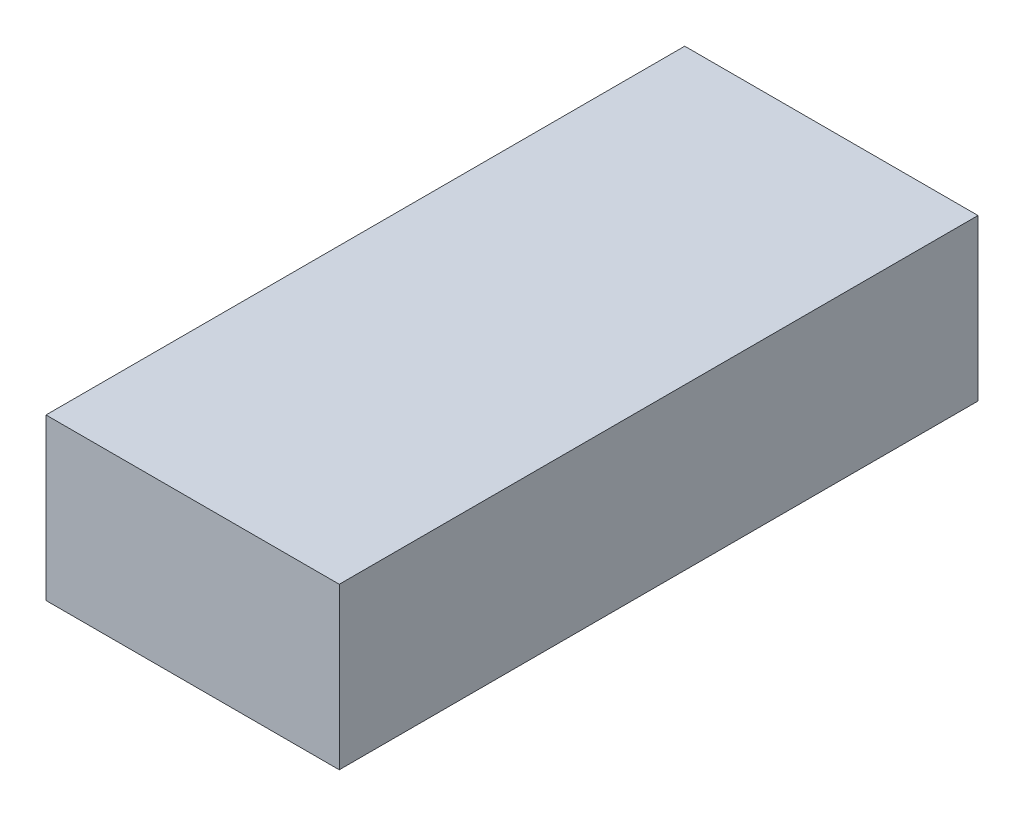
ISO-10303-21;
HEADER;
FILE_DESCRIPTION(('STEP AP214'),'2;1');
FILE_NAME('part.step','',(''),(''),'','','');
FILE_SCHEMA(('AUTOMOTIVE_DESIGN { 1 0 10303 214 1 1 1 1 }'));
ENDSEC;
DATA;
#1=APPLICATION_CONTEXT('core data for automotive mechanical design processes');
#2=APPLICATION_PROTOCOL_DEFINITION('international standard','automotive_design',2000,#1);
#3=PRODUCT_CONTEXT('',#1,'mechanical');
#4=PRODUCT('Part','Part','',(#3));
#5=PRODUCT_RELATED_PRODUCT_CATEGORY('part','',(#4));
#6=PRODUCT_DEFINITION_FORMATION('','',#4);
#7=PRODUCT_DEFINITION_CONTEXT('part definition',#1,'design');
#8=PRODUCT_DEFINITION('design','',#6,#7);
#9=PRODUCT_DEFINITION_SHAPE('','',#8);
#10=(LENGTH_UNIT() NAMED_UNIT(*) SI_UNIT(.MILLI.,.METRE.));
#11=(NAMED_UNIT(*) PLANE_ANGLE_UNIT() SI_UNIT($,.RADIAN.));
#12=(NAMED_UNIT(*) SI_UNIT($,.STERADIAN.) SOLID_ANGLE_UNIT());
#13=UNCERTAINTY_MEASURE_WITH_UNIT(LENGTH_MEASURE(1.E-05),#10,'distance_accuracy_value','');
#14=(GEOMETRIC_REPRESENTATION_CONTEXT(3) GLOBAL_UNCERTAINTY_ASSIGNED_CONTEXT((#13)) GLOBAL_UNIT_ASSIGNED_CONTEXT((#10,
#11,#12)) REPRESENTATION_CONTEXT('',''));
#15=CARTESIAN_POINT('',(0.,0.,0.));
#16=DIRECTION('',(0.,0.,1.));
#17=DIRECTION('',(1.,0.,0.));
#18=AXIS2_PLACEMENT_3D('',#15,#16,#17);
#19=CARTESIAN_POINT('',(-20.0525,15.5175,-11.971));
#20=DIRECTION('',(-1.,0.,0.));
#21=DIRECTION('',(0.,0.,1.));
#22=AXIS2_PLACEMENT_3D('',#19,#20,#21);
#23=PLANE('',#22);
#24=DIRECTION('',(0.,0.,1.));
#25=VECTOR('',#24,1.);
#26=CARTESIAN_POINT('',(-20.0525,-1.8635,-11.971));
#27=LINE('',#26,#25);
#28=CARTESIAN_POINT('',(-20.0525,-1.8635,-11.971));
#29=VERTEX_POINT('',#28);
#30=CARTESIAN_POINT('',(-20.0525,-1.8635,57.113));
#31=VERTEX_POINT('',#30);
#32=EDGE_CURVE('E42',#29,#31,#27,.T.);
#33=ORIENTED_EDGE('',*,*,#32,.T.);
#34=DIRECTION('',(0.,-1.,0.));
#35=VECTOR('',#34,1.);
#36=CARTESIAN_POINT('',(-20.0525,15.5175,57.113));
#37=LINE('',#36,#35);
#38=CARTESIAN_POINT('',(-20.0525,15.5175,57.113));
#39=VERTEX_POINT('',#38);
#40=EDGE_CURVE('E83',#39,#31,#37,.T.);
#41=ORIENTED_EDGE('',*,*,#40,.F.);
#42=DIRECTION('',(0.,0.,1.));
#43=VECTOR('',#42,1.);
#44=CARTESIAN_POINT('',(-20.0525,15.5175,-11.971));
#45=LINE('',#44,#43);
#46=CARTESIAN_POINT('',(-20.0525,15.5175,-11.971));
#47=VERTEX_POINT('',#46);
#48=EDGE_CURVE('E11',#47,#39,#45,.T.);
#49=ORIENTED_EDGE('',*,*,#48,.F.);
#50=DIRECTION('',(0.,-1.,0.));
#51=VECTOR('',#50,1.);
#52=CARTESIAN_POINT('',(-20.0525,15.5175,-11.971));
#53=LINE('',#52,#51);
#54=EDGE_CURVE('E85',#47,#29,#53,.T.);
#55=ORIENTED_EDGE('',*,*,#54,.T.);
#56=EDGE_LOOP('',(#33,#41,#49,#55));
#57=FACE_BOUND('',#56,.T.);
#58=ADVANCED_FACE('F41',(#57),#23,.T.);
#59=CARTESIAN_POINT('',(11.6665,15.5175,-11.971));
#60=DIRECTION('',(0.,1.,0.));
#61=DIRECTION('',(0.,0.,1.));
#62=AXIS2_PLACEMENT_3D('',#59,#60,#61);
#63=PLANE('',#62);
#64=ORIENTED_EDGE('',*,*,#48,.T.);
#65=DIRECTION('',(-1.,0.,0.));
#66=VECTOR('',#65,1.);
#67=CARTESIAN_POINT('',(11.6665,15.5175,57.113));
#68=LINE('',#67,#66);
#69=CARTESIAN_POINT('',(11.6665,15.5175,57.113));
#70=VERTEX_POINT('',#69);
#71=EDGE_CURVE('E97',#70,#39,#68,.T.);
#72=ORIENTED_EDGE('',*,*,#71,.F.);
#73=DIRECTION('',(0.,0.,1.));
#74=VECTOR('',#73,1.);
#75=CARTESIAN_POINT('',(11.6665,15.5175,-11.971));
#76=LINE('',#75,#74);
#77=CARTESIAN_POINT('',(11.6665,15.5175,-11.971));
#78=VERTEX_POINT('',#77);
#79=EDGE_CURVE('E47',#78,#70,#76,.T.);
#80=ORIENTED_EDGE('',*,*,#79,.F.);
#81=DIRECTION('',(-1.,0.,0.));
#82=VECTOR('',#81,1.);
#83=CARTESIAN_POINT('',(11.6665,15.5175,-11.971));
#84=LINE('',#83,#82);
#85=EDGE_CURVE('E90',#78,#47,#84,.T.);
#86=ORIENTED_EDGE('',*,*,#85,.T.);
#87=EDGE_LOOP('',(#64,#72,#80,#86));
#88=FACE_BOUND('',#87,.T.);
#89=ADVANCED_FACE('F111',(#88),#63,.T.);
#90=CARTESIAN_POINT('',(11.6665,-1.8635,-11.971));
#91=DIRECTION('',(1.,0.,0.));
#92=DIRECTION('',(0.,0.,-1.));
#93=AXIS2_PLACEMENT_3D('',#90,#91,#92);
#94=PLANE('',#93);
#95=ORIENTED_EDGE('',*,*,#79,.T.);
#96=DIRECTION('',(0.,1.,0.));
#97=VECTOR('',#96,1.);
#98=CARTESIAN_POINT('',(11.6665,-1.8635,57.113));
#99=LINE('',#98,#97);
#100=CARTESIAN_POINT('',(11.6665,-1.8635,57.113));
#101=VERTEX_POINT('',#100);
#102=EDGE_CURVE('E92',#101,#70,#99,.T.);
#103=ORIENTED_EDGE('',*,*,#102,.F.);
#104=DIRECTION('',(0.,0.,1.));
#105=VECTOR('',#104,1.);
#106=CARTESIAN_POINT('',(11.6665,-1.8635,-11.971));
#107=LINE('',#106,#105);
#108=CARTESIAN_POINT('',(11.6665,-1.8635,-11.971));
#109=VERTEX_POINT('',#108);
#110=EDGE_CURVE('E86',#109,#101,#107,.T.);
#111=ORIENTED_EDGE('',*,*,#110,.F.);
#112=DIRECTION('',(0.,1.,0.));
#113=VECTOR('',#112,1.);
#114=CARTESIAN_POINT('',(11.6665,-1.8635,-11.971));
#115=LINE('',#114,#113);
#116=EDGE_CURVE('E107',#109,#78,#115,.T.);
#117=ORIENTED_EDGE('',*,*,#116,.T.);
#118=EDGE_LOOP('',(#95,#103,#111,#117));
#119=FACE_BOUND('',#118,.T.);
#120=ADVANCED_FACE('F108',(#119),#94,.T.);
#121=CARTESIAN_POINT('',(-20.0525,-1.8635,-11.971));
#122=DIRECTION('',(0.,-1.,0.));
#123=DIRECTION('',(0.,0.,-1.));
#124=AXIS2_PLACEMENT_3D('',#121,#122,#123);
#125=PLANE('',#124);
#126=ORIENTED_EDGE('',*,*,#110,.T.);
#127=DIRECTION('',(1.,0.,0.));
#128=VECTOR('',#127,1.);
#129=CARTESIAN_POINT('',(-20.0525,-1.8635,57.113));
#130=LINE('',#129,#128);
#131=EDGE_CURVE('E87',#31,#101,#130,.T.);
#132=ORIENTED_EDGE('',*,*,#131,.F.);
#133=ORIENTED_EDGE('',*,*,#32,.F.);
#134=DIRECTION('',(1.,0.,0.));
#135=VECTOR('',#134,1.);
#136=CARTESIAN_POINT('',(-20.0525,-1.8635,-11.971));
#137=LINE('',#136,#135);
#138=EDGE_CURVE('E101',#29,#109,#137,.T.);
#139=ORIENTED_EDGE('',*,*,#138,.T.);
#140=EDGE_LOOP('',(#126,#132,#133,#139));
#141=FACE_BOUND('',#140,.T.);
#142=ADVANCED_FACE('F89',(#141),#125,.T.);
#143=CARTESIAN_POINT('',(0.,0.,-11.971));
#144=DIRECTION('',(0.,0.,1.));
#145=DIRECTION('',(1.,0.,0.));
#146=AXIS2_PLACEMENT_3D('',#143,#144,#145);
#147=PLANE('',#146);
#148=ORIENTED_EDGE('',*,*,#54,.F.);
#149=ORIENTED_EDGE('',*,*,#85,.F.);
#150=ORIENTED_EDGE('',*,*,#116,.F.);
#151=ORIENTED_EDGE('',*,*,#138,.F.);
#152=EDGE_LOOP('',(#148,#149,#150,#151));
#153=FACE_BOUND('',#152,.T.);
#154=ADVANCED_FACE('F113',(#153),#147,.F.);
#155=CARTESIAN_POINT('',(0.,0.,57.113));
#156=DIRECTION('',(0.,0.,1.));
#157=DIRECTION('',(1.,0.,0.));
#158=AXIS2_PLACEMENT_3D('',#155,#156,#157);
#159=PLANE('',#158);
#160=ORIENTED_EDGE('',*,*,#40,.T.);
#161=ORIENTED_EDGE('',*,*,#131,.T.);
#162=ORIENTED_EDGE('',*,*,#102,.T.);
#163=ORIENTED_EDGE('',*,*,#71,.T.);
#164=EDGE_LOOP('',(#160,#161,#162,#163));
#165=FACE_BOUND('',#164,.T.);
#166=ADVANCED_FACE('F100',(#165),#159,.T.);
#167=CLOSED_SHELL('',(#58,#89,#120,#142,#154,#166));
#168=MANIFOLD_SOLID_BREP('B2',#167);
#169=ADVANCED_BREP_SHAPE_REPRESENTATION('',(#18,#168),#14);
#170=SHAPE_DEFINITION_REPRESENTATION(#9,#169);
ENDSEC;
END-ISO-10303-21;
